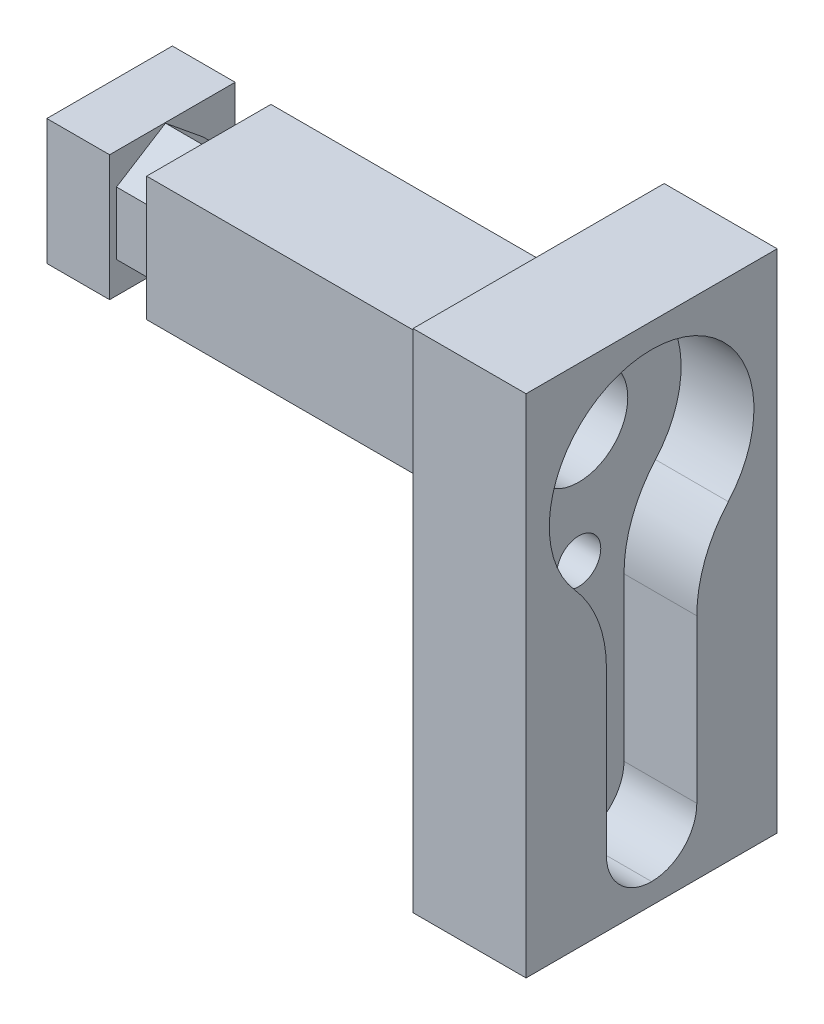
ISO-10303-21;
HEADER;
FILE_DESCRIPTION(('STEP AP214'),'2;1');
FILE_NAME('part.step','',(''),(''),'','','');
FILE_SCHEMA(('AUTOMOTIVE_DESIGN { 1 0 10303 214 1 1 1 1 }'));
ENDSEC;
DATA;
#1=APPLICATION_CONTEXT('core data for automotive mechanical design processes');
#2=APPLICATION_PROTOCOL_DEFINITION('international standard','automotive_design',2000,#1);
#3=PRODUCT_CONTEXT('',#1,'mechanical');
#4=PRODUCT('Part','Part','',(#3));
#5=PRODUCT_RELATED_PRODUCT_CATEGORY('part','',(#4));
#6=PRODUCT_DEFINITION_FORMATION('','',#4);
#7=PRODUCT_DEFINITION_CONTEXT('part definition',#1,'design');
#8=PRODUCT_DEFINITION('design','',#6,#7);
#9=PRODUCT_DEFINITION_SHAPE('','',#8);
#10=(LENGTH_UNIT() NAMED_UNIT(*) SI_UNIT(.MILLI.,.METRE.));
#11=(NAMED_UNIT(*) PLANE_ANGLE_UNIT() SI_UNIT($,.RADIAN.));
#12=(NAMED_UNIT(*) SI_UNIT($,.STERADIAN.) SOLID_ANGLE_UNIT());
#13=UNCERTAINTY_MEASURE_WITH_UNIT(LENGTH_MEASURE(1.E-05),#10,'distance_accuracy_value','');
#14=(GEOMETRIC_REPRESENTATION_CONTEXT(3) GLOBAL_UNCERTAINTY_ASSIGNED_CONTEXT((#13)) GLOBAL_UNIT_ASSIGNED_CONTEXT((#10,
#11,#12)) REPRESENTATION_CONTEXT('',''));
#15=CARTESIAN_POINT('',(0.,0.,0.));
#16=DIRECTION('',(0.,0.,1.));
#17=DIRECTION('',(1.,0.,0.));
#18=AXIS2_PLACEMENT_3D('',#15,#16,#17);
#19=CARTESIAN_POINT('',(-3.27,0.,0.));
#20=DIRECTION('',(1.,0.,0.));
#21=DIRECTION('',(0.,0.,-1.));
#22=AXIS2_PLACEMENT_3D('',#19,#20,#21);
#23=PLANE('',#22);
#24=DIRECTION('',(0.,0.531949195849785,-0.846776270944555));
#25=VECTOR('',#24,1.);
#26=CARTESIAN_POINT('',(-3.27,4.95,0.549999999999998));
#27=LINE('',#26,#25);
#28=CARTESIAN_POINT('',(-3.27,2.5,4.45));
#29=VERTEX_POINT('',#28);
#30=CARTESIAN_POINT('',(-3.27,4.95,0.549999999999996));
#31=VERTEX_POINT('',#30);
#32=EDGE_CURVE('E52',#29,#31,#27,.T.);
#33=ORIENTED_EDGE('',*,*,#32,.F.);
#34=DIRECTION('',(0.,1.,0.));
#35=VECTOR('',#34,1.);
#36=CARTESIAN_POINT('',(-3.27,2.5,4.45));
#37=LINE('',#36,#35);
#38=CARTESIAN_POINT('',(-3.27,-2.5,4.45));
#39=VERTEX_POINT('',#38);
#40=EDGE_CURVE('E56',#39,#29,#37,.T.);
#41=ORIENTED_EDGE('',*,*,#40,.F.);
#42=DIRECTION('',(0.,0.531949195849785,0.846776270944555));
#43=VECTOR('',#42,1.);
#44=CARTESIAN_POINT('',(-3.27,-2.5,4.45));
#45=LINE('',#44,#43);
#46=CARTESIAN_POINT('',(-3.27,-4.95,0.549999999999999));
#47=VERTEX_POINT('',#46);
#48=EDGE_CURVE('E261',#47,#39,#45,.T.);
#49=ORIENTED_EDGE('',*,*,#48,.F.);
#50=DIRECTION('',(0.,0.,1.));
#51=VECTOR('',#50,1.);
#52=CARTESIAN_POINT('',(-3.27,-4.95,4.95));
#53=LINE('',#52,#51);
#54=CARTESIAN_POINT('',(-3.27,-4.95,4.95));
#55=VERTEX_POINT('',#54);
#56=EDGE_CURVE('E285',#47,#55,#53,.T.);
#57=ORIENTED_EDGE('',*,*,#56,.T.);
#58=DIRECTION('',(0.,1.,0.));
#59=VECTOR('',#58,1.);
#60=CARTESIAN_POINT('',(-3.27,4.95,4.95));
#61=LINE('',#60,#59);
#62=CARTESIAN_POINT('',(-3.27,4.95,4.95));
#63=VERTEX_POINT('',#62);
#64=EDGE_CURVE('E290',#55,#63,#61,.T.);
#65=ORIENTED_EDGE('',*,*,#64,.T.);
#66=DIRECTION('',(0.,0.,-1.));
#67=VECTOR('',#66,1.);
#68=CARTESIAN_POINT('',(-3.27,4.95,4.95));
#69=LINE('',#68,#67);
#70=EDGE_CURVE('E293',#63,#31,#69,.T.);
#71=ORIENTED_EDGE('',*,*,#70,.T.);
#72=EDGE_LOOP('',(#33,#41,#49,#57,#65,#71));
#73=FACE_BOUND('',#72,.T.);
#74=ADVANCED_FACE('F36',(#73),#23,.F.);
#75=DIRECTION('',(0.,-0.632534570862424,0.774532127586641));
#76=VECTOR('',#75,1.);
#77=CARTESIAN_POINT('',(-3.27,-2.5,-2.45));
#78=LINE('',#77,#76);
#79=CARTESIAN_POINT('',(-3.27,-2.5,-2.45));
#80=VERTEX_POINT('',#79);
#81=EDGE_CURVE('E258',#80,#47,#78,.T.);
#82=ORIENTED_EDGE('',*,*,#81,.F.);
#83=DIRECTION('',(0.,-1.,0.));
#84=VECTOR('',#83,1.);
#85=CARTESIAN_POINT('',(-3.27,2.5,-2.45));
#86=LINE('',#85,#84);
#87=CARTESIAN_POINT('',(-3.27,2.5,-2.45));
#88=VERTEX_POINT('',#87);
#89=EDGE_CURVE('E255',#88,#80,#86,.T.);
#90=ORIENTED_EDGE('',*,*,#89,.F.);
#91=DIRECTION('',(0.,-0.632534570862424,-0.774532127586641));
#92=VECTOR('',#91,1.);
#93=CARTESIAN_POINT('',(-3.27,4.95,0.549999999999998));
#94=LINE('',#93,#92);
#95=EDGE_CURVE('E228',#31,#88,#94,.T.);
#96=ORIENTED_EDGE('',*,*,#95,.F.);
#97=CARTESIAN_POINT('',(-3.27,4.95,-4.95));
#98=VERTEX_POINT('',#97);
#99=EDGE_CURVE('E292',#31,#98,#69,.T.);
#100=ORIENTED_EDGE('',*,*,#99,.T.);
#101=DIRECTION('',(0.,-1.,0.));
#102=VECTOR('',#101,1.);
#103=CARTESIAN_POINT('',(-3.27,4.95,-4.95));
#104=LINE('',#103,#102);
#105=CARTESIAN_POINT('',(-3.27,-4.95,-4.95));
#106=VERTEX_POINT('',#105);
#107=EDGE_CURVE('E282',#98,#106,#104,.T.);
#108=ORIENTED_EDGE('',*,*,#107,.T.);
#109=EDGE_CURVE('E287',#106,#47,#53,.T.);
#110=ORIENTED_EDGE('',*,*,#109,.T.);
#111=EDGE_LOOP('',(#82,#90,#96,#100,#108,#110));
#112=FACE_BOUND('',#111,.T.);
#113=ADVANCED_FACE('F457',(#112),#23,.F.);
#114=CARTESIAN_POINT('',(23.,0.,0.));
#115=DIRECTION('',(1.,0.,0.));
#116=DIRECTION('',(0.,0.,-1.));
#117=AXIS2_PLACEMENT_3D('',#114,#115,#116);
#118=PLANE('',#117);
#119=CARTESIAN_POINT('',(23.,-20.6,0.));
#120=DIRECTION('',(1.,0.,0.));
#121=DIRECTION('',(0.,0.,-1.));
#122=AXIS2_PLACEMENT_3D('',#119,#120,#121);
#123=CIRCLE('',#122,1.75);
#124=CARTESIAN_POINT('',(23.,-20.6,-1.75));
#125=VERTEX_POINT('',#124);
#126=EDGE_CURVE('E331',#125,#125,#123,.F.);
#127=ORIENTED_EDGE('',*,*,#126,.F.);
#128=EDGE_LOOP('',(#127));
#129=FACE_BOUND('',#128,.T.);
#130=DIRECTION('',(0.,0.,-1.));
#131=VECTOR('',#130,1.);
#132=CARTESIAN_POINT('',(23.,-30.2,0.));
#133=LINE('',#132,#131);
#134=CARTESIAN_POINT('',(23.,-30.2,9.99999999999999));
#135=VERTEX_POINT('',#134);
#136=CARTESIAN_POINT('',(23.,-30.2,-10.));
#137=VERTEX_POINT('',#136);
#138=EDGE_CURVE('E322',#135,#137,#133,.T.);
#139=ORIENTED_EDGE('',*,*,#138,.F.);
#140=DIRECTION('',(0.,-1.,0.));
#141=VECTOR('',#140,1.);
#142=CARTESIAN_POINT('',(23.,10.,10.));
#143=LINE('',#142,#141);
#144=CARTESIAN_POINT('',(23.,10.1,10.));
#145=VERTEX_POINT('',#144);
#146=EDGE_CURVE('E325',#145,#135,#143,.T.);
#147=ORIENTED_EDGE('',*,*,#146,.F.);
#148=DIRECTION('',(0.,0.,-1.));
#149=VECTOR('',#148,1.);
#150=CARTESIAN_POINT('',(23.,10.1,10.1));
#151=LINE('',#150,#149);
#152=CARTESIAN_POINT('',(23.,10.1,-10.));
#153=VERTEX_POINT('',#152);
#154=EDGE_CURVE('E320',#145,#153,#151,.T.);
#155=ORIENTED_EDGE('',*,*,#154,.T.);
#156=DIRECTION('',(0.,1.,0.));
#157=VECTOR('',#156,1.);
#158=CARTESIAN_POINT('',(23.,10.,-10.));
#159=LINE('',#158,#157);
#160=EDGE_CURVE('E328',#137,#153,#159,.T.);
#161=ORIENTED_EDGE('',*,*,#160,.F.);
#162=EDGE_LOOP('',(#139,#147,#155,#161));
#163=FACE_BOUND('',#162,.T.);
#164=CARTESIAN_POINT('',(23.,-9.35,0.));
#165=DIRECTION('',(1.,0.,0.));
#166=DIRECTION('',(0.,0.,-1.));
#167=AXIS2_PLACEMENT_3D('',#164,#165,#166);
#168=CIRCLE('',#167,1.75);
#169=CARTESIAN_POINT('',(23.,-9.35,-1.75));
#170=VERTEX_POINT('',#169);
#171=EDGE_CURVE('E334',#170,#170,#168,.F.);
#172=ORIENTED_EDGE('',*,*,#171,.F.);
#173=EDGE_LOOP('',(#172));
#174=FACE_BOUND('',#173,.T.);
#175=DIRECTION('',(0.,-1.,0.));
#176=VECTOR('',#175,1.);
#177=CARTESIAN_POINT('',(23.,4.95,-4.95));
#178=LINE('',#177,#176);
#179=CARTESIAN_POINT('',(23.,4.95,-4.95));
#180=VERTEX_POINT('',#179);
#181=CARTESIAN_POINT('',(23.,-4.95,-4.95));
#182=VERTEX_POINT('',#181);
#183=EDGE_CURVE('E281',#180,#182,#178,.T.);
#184=ORIENTED_EDGE('',*,*,#183,.F.);
#185=DIRECTION('',(0.,0.,-1.));
#186=VECTOR('',#185,1.);
#187=CARTESIAN_POINT('',(23.,4.95,4.95));
#188=LINE('',#187,#186);
#189=CARTESIAN_POINT('',(23.,4.95,4.95));
#190=VERTEX_POINT('',#189);
#191=EDGE_CURVE('E286',#190,#180,#188,.T.);
#192=ORIENTED_EDGE('',*,*,#191,.F.);
#193=DIRECTION('',(0.,1.,0.));
#194=VECTOR('',#193,1.);
#195=CARTESIAN_POINT('',(23.,4.95,4.95));
#196=LINE('',#195,#194);
#197=CARTESIAN_POINT('',(23.,-4.95,4.95));
#198=VERTEX_POINT('',#197);
#199=EDGE_CURVE('E301',#198,#190,#196,.T.);
#200=ORIENTED_EDGE('',*,*,#199,.F.);
#201=DIRECTION('',(0.,0.,1.));
#202=VECTOR('',#201,1.);
#203=CARTESIAN_POINT('',(23.,-4.95,4.95));
#204=LINE('',#203,#202);
#205=EDGE_CURVE('E298',#182,#198,#204,.T.);
#206=ORIENTED_EDGE('',*,*,#205,.F.);
#207=EDGE_LOOP('',(#184,#192,#200,#206));
#208=FACE_BOUND('',#207,.T.);
#209=ADVANCED_FACE('F462',(#129,#163,#174,#208),#118,.F.);
#210=CARTESIAN_POINT('',(32.,0.,0.));
#211=DIRECTION('',(-1.,0.,0.));
#212=DIRECTION('',(0.,0.,1.));
#213=AXIS2_PLACEMENT_3D('',#210,#211,#212);
#214=CYLINDRICAL_SURFACE('',#213,3.9);
#215=CARTESIAN_POINT('',(23.,0.,0.));
#216=DIRECTION('',(1.,0.,0.));
#217=DIRECTION('',(0.,0.,-1.));
#218=AXIS2_PLACEMENT_3D('',#215,#216,#217);
#219=CIRCLE('',#218,3.9);
#220=CARTESIAN_POINT('',(23.,0.,-3.9));
#221=VERTEX_POINT('',#220);
#222=EDGE_CURVE('E317',#221,#221,#219,.F.);
#223=ORIENTED_EDGE('',*,*,#222,.T.);
#224=EDGE_LOOP('',(#223));
#225=FACE_BOUND('',#224,.T.);
#226=CARTESIAN_POINT('',(26.2,0.,0.));
#227=DIRECTION('',(1.,0.,0.));
#228=DIRECTION('',(0.,0.,-1.));
#229=AXIS2_PLACEMENT_3D('',#226,#227,#228);
#230=CIRCLE('',#229,3.9);
#231=CARTESIAN_POINT('',(26.2,0.,-3.9));
#232=VERTEX_POINT('',#231);
#233=EDGE_CURVE('E40',#232,#232,#230,.T.);
#234=ORIENTED_EDGE('',*,*,#233,.T.);
#235=EDGE_LOOP('',(#234));
#236=FACE_BOUND('',#235,.T.);
#237=ADVANCED_FACE('F491',(#225,#236),#214,.F.);
#238=CARTESIAN_POINT('',(20.,10.,-10.));
#239=DIRECTION('',(0.,0.,1.));
#240=DIRECTION('',(0.,-1.,0.));
#241=AXIS2_PLACEMENT_3D('',#238,#239,#240);
#242=PLANE('',#241);
#243=DIRECTION('',(-1.,0.,0.));
#244=VECTOR('',#243,1.);
#245=CARTESIAN_POINT('',(43.8,-30.2,-10.));
#246=LINE('',#245,#244);
#247=CARTESIAN_POINT('',(32.,-30.2,-10.));
#248=VERTEX_POINT('',#247);
#249=EDGE_CURVE('E346',#248,#137,#246,.T.);
#250=ORIENTED_EDGE('',*,*,#249,.T.);
#251=ORIENTED_EDGE('',*,*,#160,.T.);
#252=DIRECTION('',(-1.,0.,0.));
#253=VECTOR('',#252,1.);
#254=CARTESIAN_POINT('',(32.,10.1,-10.));
#255=LINE('',#254,#253);
#256=CARTESIAN_POINT('',(32.,10.1,-10.));
#257=VERTEX_POINT('',#256);
#258=EDGE_CURVE('E340',#257,#153,#255,.T.);
#259=ORIENTED_EDGE('',*,*,#258,.F.);
#260=DIRECTION('',(0.,-1.,0.));
#261=VECTOR('',#260,1.);
#262=CARTESIAN_POINT('',(32.,0.,-10.));
#263=LINE('',#262,#261);
#264=EDGE_CURVE('E354',#257,#248,#263,.T.);
#265=ORIENTED_EDGE('',*,*,#264,.T.);
#266=EDGE_LOOP('',(#250,#251,#259,#265));
#267=FACE_BOUND('',#266,.T.);
#268=ADVANCED_FACE('F510',(#267),#242,.F.);
#269=CARTESIAN_POINT('',(20.,10.,10.));
#270=DIRECTION('',(0.,0.,-1.));
#271=DIRECTION('',(-1.,0.,0.));
#272=AXIS2_PLACEMENT_3D('',#269,#270,#271);
#273=PLANE('',#272);
#274=DIRECTION('',(1.,0.,0.));
#275=VECTOR('',#274,1.);
#276=CARTESIAN_POINT('',(32.,10.1,10.));
#277=LINE('',#276,#275);
#278=CARTESIAN_POINT('',(32.,10.1,10.));
#279=VERTEX_POINT('',#278);
#280=EDGE_CURVE('E343',#145,#279,#277,.T.);
#281=ORIENTED_EDGE('',*,*,#280,.F.);
#282=ORIENTED_EDGE('',*,*,#146,.T.);
#283=DIRECTION('',(-1.,0.,0.));
#284=VECTOR('',#283,1.);
#285=CARTESIAN_POINT('',(43.8,-30.2,9.99999999999999));
#286=LINE('',#285,#284);
#287=CARTESIAN_POINT('',(32.,-30.2,9.99999999999999));
#288=VERTEX_POINT('',#287);
#289=EDGE_CURVE('E345',#288,#135,#286,.T.);
#290=ORIENTED_EDGE('',*,*,#289,.F.);
#291=DIRECTION('',(0.,1.,0.));
#292=VECTOR('',#291,1.);
#293=CARTESIAN_POINT('',(32.,0.,9.99999999999999));
#294=LINE('',#293,#292);
#295=EDGE_CURVE('E349',#288,#279,#294,.T.);
#296=ORIENTED_EDGE('',*,*,#295,.T.);
#297=EDGE_LOOP('',(#281,#282,#290,#296));
#298=FACE_BOUND('',#297,.T.);
#299=ADVANCED_FACE('F523',(#298),#273,.F.);
#300=CARTESIAN_POINT('',(32.,0.,0.));
#301=DIRECTION('',(1.,0.,0.));
#302=DIRECTION('',(0.,0.,-1.));
#303=AXIS2_PLACEMENT_3D('',#300,#301,#302);
#304=PLANE('',#303);
#305=ORIENTED_EDGE('',*,*,#264,.F.);
#306=DIRECTION('',(0.,0.,-1.));
#307=VECTOR('',#306,1.);
#308=CARTESIAN_POINT('',(32.,10.1,-10.));
#309=LINE('',#308,#307);
#310=EDGE_CURVE('E337',#279,#257,#309,.T.);
#311=ORIENTED_EDGE('',*,*,#310,.F.);
#312=ORIENTED_EDGE('',*,*,#295,.F.);
#313=DIRECTION('',(0.,0.,1.));
#314=VECTOR('',#313,1.);
#315=CARTESIAN_POINT('',(32.,-30.2,22.5));
#316=LINE('',#315,#314);
#317=EDGE_CURVE('E356',#248,#288,#316,.T.);
#318=ORIENTED_EDGE('',*,*,#317,.F.);
#319=EDGE_LOOP('',(#305,#311,#312,#318));
#320=FACE_BOUND('',#319,.T.);
#321=DIRECTION('',(0.,-1.,0.));
#322=VECTOR('',#321,1.);
#323=CARTESIAN_POINT('',(32.,-28.55,3.60000000000001));
#324=LINE('',#323,#322);
#325=CARTESIAN_POINT('',(32.,-12.0192553845902,3.6));
#326=VERTEX_POINT('',#325);
#327=CARTESIAN_POINT('',(32.,-24.95,3.60000000000001));
#328=VERTEX_POINT('',#327);
#329=EDGE_CURVE('E375',#326,#328,#324,.T.);
#330=ORIENTED_EDGE('',*,*,#329,.F.);
#331=CARTESIAN_POINT('',(32.,-12.0192553845902,13.6));
#332=DIRECTION('',(1.,0.,0.));
#333=DIRECTION('',(0.,0.,-1.));
#334=AXIS2_PLACEMENT_3D('',#331,#332,#333);
#335=CIRCLE('',#334,10.);
#336=CARTESIAN_POINT('',(32.,-5.39707610933388,6.1068870523416));
#337=VERTEX_POINT('',#336);
#338=EDGE_CURVE('E403',#326,#337,#335,.T.);
#339=ORIENTED_EDGE('',*,*,#338,.T.);
#340=CARTESIAN_POINT('',(32.,0.,0.));
#341=DIRECTION('',(1.,0.,0.));
#342=DIRECTION('',(0.,0.,-1.));
#343=AXIS2_PLACEMENT_3D('',#340,#341,#342);
#344=CIRCLE('',#343,8.15);
#345=CARTESIAN_POINT('',(32.,-5.39707610933388,-6.1068870523416));
#346=VERTEX_POINT('',#345);
#347=EDGE_CURVE('E368',#346,#337,#344,.T.);
#348=ORIENTED_EDGE('',*,*,#347,.F.);
#349=CARTESIAN_POINT('',(32.,-12.0192553845902,-13.6));
#350=DIRECTION('',(1.,0.,0.));
#351=DIRECTION('',(0.,0.,-1.));
#352=AXIS2_PLACEMENT_3D('',#349,#350,#351);
#353=CIRCLE('',#352,10.);
#354=CARTESIAN_POINT('',(32.,-12.0192553845902,-3.6));
#355=VERTEX_POINT('',#354);
#356=EDGE_CURVE('E401',#346,#355,#353,.T.);
#357=ORIENTED_EDGE('',*,*,#356,.T.);
#358=DIRECTION('',(0.,1.,0.));
#359=VECTOR('',#358,1.);
#360=CARTESIAN_POINT('',(32.,-28.55,-3.59999999999999));
#361=LINE('',#360,#359);
#362=CARTESIAN_POINT('',(32.,-24.95,-3.59999999999999));
#363=VERTEX_POINT('',#362);
#364=EDGE_CURVE('E377',#363,#355,#361,.T.);
#365=ORIENTED_EDGE('',*,*,#364,.F.);
#366=CARTESIAN_POINT('',(32.,-24.95,0.));
#367=DIRECTION('',(1.,0.,0.));
#368=DIRECTION('',(0.,0.,-1.));
#369=AXIS2_PLACEMENT_3D('',#366,#367,#368);
#370=CIRCLE('',#369,3.6);
#371=CARTESIAN_POINT('',(32.,-28.55,0.));
#372=VERTEX_POINT('',#371);
#373=EDGE_CURVE('E394',#363,#372,#370,.F.);
#374=ORIENTED_EDGE('',*,*,#373,.T.);
#375=CARTESIAN_POINT('',(32.,-24.95,0.));
#376=DIRECTION('',(1.,0.,0.));
#377=DIRECTION('',(0.,0.,-1.));
#378=AXIS2_PLACEMENT_3D('',#375,#376,#377);
#379=CIRCLE('',#378,3.6);
#380=EDGE_CURVE('E391',#372,#328,#379,.F.);
#381=ORIENTED_EDGE('',*,*,#380,.T.);
#382=EDGE_LOOP('',(#330,#339,#348,#357,#365,#374,#381));
#383=FACE_BOUND('',#382,.T.);
#384=ADVANCED_FACE('F428',(#320,#383),#304,.T.);
#385=CARTESIAN_POINT('',(26.2,-28.55,3.60000000000001));
#386=DIRECTION('',(0.,0.,1.));
#387=DIRECTION('',(0.,-1.,0.));
#388=AXIS2_PLACEMENT_3D('',#385,#386,#387);
#389=PLANE('',#388);
#390=DIRECTION('',(0.,-1.,0.));
#391=VECTOR('',#390,1.);
#392=CARTESIAN_POINT('',(26.2,-28.55,3.60000000000001));
#393=LINE('',#392,#391);
#394=CARTESIAN_POINT('',(26.2,-12.0192553845902,3.6));
#395=VERTEX_POINT('',#394);
#396=CARTESIAN_POINT('',(26.2,-24.95,3.60000000000001));
#397=VERTEX_POINT('',#396);
#398=EDGE_CURVE('E365',#395,#397,#393,.T.);
#399=ORIENTED_EDGE('',*,*,#398,.F.);
#400=DIRECTION('',(1.,0.,0.));
#401=VECTOR('',#400,1.);
#402=CARTESIAN_POINT('',(26.2,-12.0192553845902,3.6));
#403=LINE('',#402,#401);
#404=EDGE_CURVE('E396',#395,#326,#403,.T.);
#405=ORIENTED_EDGE('',*,*,#404,.T.);
#406=ORIENTED_EDGE('',*,*,#329,.T.);
#407=DIRECTION('',(1.,0.,0.));
#408=VECTOR('',#407,1.);
#409=CARTESIAN_POINT('',(26.2,-24.95,3.60000000000001));
#410=LINE('',#409,#408);
#411=EDGE_CURVE('E374',#328,#397,#410,.F.);
#412=ORIENTED_EDGE('',*,*,#411,.T.);
#413=EDGE_LOOP('',(#399,#405,#406,#412));
#414=FACE_BOUND('',#413,.T.);
#415=ADVANCED_FACE('F422',(#414),#389,.F.);
#416=CARTESIAN_POINT('',(26.2,0.,0.));
#417=DIRECTION('',(1.,0.,0.));
#418=DIRECTION('',(0.,0.,-1.));
#419=AXIS2_PLACEMENT_3D('',#416,#417,#418);
#420=CYLINDRICAL_SURFACE('',#419,8.15);
#421=ORIENTED_EDGE('',*,*,#347,.T.);
#422=DIRECTION('',(1.,0.,0.));
#423=VECTOR('',#422,1.);
#424=CARTESIAN_POINT('',(26.2,-5.39707610933388,6.1068870523416));
#425=LINE('',#424,#423);
#426=CARTESIAN_POINT('',(26.2,-5.39707610933388,6.1068870523416));
#427=VERTEX_POINT('',#426);
#428=EDGE_CURVE('E408',#337,#427,#425,.F.);
#429=ORIENTED_EDGE('',*,*,#428,.T.);
#430=CARTESIAN_POINT('',(26.2,0.,0.));
#431=DIRECTION('',(1.,0.,0.));
#432=DIRECTION('',(0.,0.,-1.));
#433=AXIS2_PLACEMENT_3D('',#430,#431,#432);
#434=CIRCLE('',#433,8.15);
#435=CARTESIAN_POINT('',(26.2,-5.39707610933388,-6.1068870523416));
#436=VERTEX_POINT('',#435);
#437=EDGE_CURVE('E371',#436,#427,#434,.T.);
#438=ORIENTED_EDGE('',*,*,#437,.F.);
#439=DIRECTION('',(1.,0.,0.));
#440=VECTOR('',#439,1.);
#441=CARTESIAN_POINT('',(26.2,-5.39707610933388,-6.1068870523416));
#442=LINE('',#441,#440);
#443=EDGE_CURVE('E405',#436,#346,#442,.T.);
#444=ORIENTED_EDGE('',*,*,#443,.T.);
#445=EDGE_LOOP('',(#421,#429,#438,#444));
#446=FACE_BOUND('',#445,.T.);
#447=ADVANCED_FACE('F430',(#446),#420,.F.);
#448=CARTESIAN_POINT('',(26.2,-28.55,-3.59999999999999));
#449=DIRECTION('',(0.,0.,-1.));
#450=DIRECTION('',(0.,1.,0.));
#451=AXIS2_PLACEMENT_3D('',#448,#449,#450);
#452=PLANE('',#451);
#453=ORIENTED_EDGE('',*,*,#364,.T.);
#454=DIRECTION('',(1.,0.,0.));
#455=VECTOR('',#454,1.);
#456=CARTESIAN_POINT('',(26.2,-12.0192553845902,-3.6));
#457=LINE('',#456,#455);
#458=CARTESIAN_POINT('',(26.2,-12.0192553845902,-3.6));
#459=VERTEX_POINT('',#458);
#460=EDGE_CURVE('E410',#355,#459,#457,.F.);
#461=ORIENTED_EDGE('',*,*,#460,.T.);
#462=DIRECTION('',(0.,1.,0.));
#463=VECTOR('',#462,1.);
#464=CARTESIAN_POINT('',(26.2,-28.55,-3.59999999999999));
#465=LINE('',#464,#463);
#466=CARTESIAN_POINT('',(26.2,-24.95,-3.59999999999999));
#467=VERTEX_POINT('',#466);
#468=EDGE_CURVE('E367',#467,#459,#465,.T.);
#469=ORIENTED_EDGE('',*,*,#468,.F.);
#470=DIRECTION('',(1.,0.,0.));
#471=VECTOR('',#470,1.);
#472=CARTESIAN_POINT('',(32.,-24.95,-3.59999999999999));
#473=LINE('',#472,#471);
#474=EDGE_CURVE('E389',#467,#363,#473,.T.);
#475=ORIENTED_EDGE('',*,*,#474,.T.);
#476=EDGE_LOOP('',(#453,#461,#469,#475));
#477=FACE_BOUND('',#476,.T.);
#478=ADVANCED_FACE('F438',(#477),#452,.F.);
#479=CARTESIAN_POINT('',(26.2,0.,0.));
#480=DIRECTION('',(1.,0.,0.));
#481=DIRECTION('',(0.,0.,-1.));
#482=AXIS2_PLACEMENT_3D('',#479,#480,#481);
#483=PLANE('',#482);
#484=CARTESIAN_POINT('',(26.2,-20.6,0.));
#485=DIRECTION('',(1.,0.,0.));
#486=DIRECTION('',(0.,0.,-1.));
#487=AXIS2_PLACEMENT_3D('',#484,#485,#486);
#488=CIRCLE('',#487,1.75);
#489=CARTESIAN_POINT('',(26.2,-20.6,-1.75));
#490=VERTEX_POINT('',#489);
#491=EDGE_CURVE('E360',#490,#490,#488,.T.);
#492=ORIENTED_EDGE('',*,*,#491,.F.);
#493=EDGE_LOOP('',(#492));
#494=FACE_BOUND('',#493,.T.);
#495=CARTESIAN_POINT('',(26.2,-9.35,0.));
#496=DIRECTION('',(1.,0.,0.));
#497=DIRECTION('',(0.,0.,-1.));
#498=AXIS2_PLACEMENT_3D('',#495,#496,#497);
#499=CIRCLE('',#498,1.75);
#500=CARTESIAN_POINT('',(26.2,-9.35,-1.75));
#501=VERTEX_POINT('',#500);
#502=EDGE_CURVE('E359',#501,#501,#499,.T.);
#503=ORIENTED_EDGE('',*,*,#502,.F.);
#504=EDGE_LOOP('',(#503));
#505=FACE_BOUND('',#504,.T.);
#506=ORIENTED_EDGE('',*,*,#233,.F.);
#507=EDGE_LOOP('',(#506));
#508=FACE_BOUND('',#507,.T.);
#509=ORIENTED_EDGE('',*,*,#437,.T.);
#510=CARTESIAN_POINT('',(26.2,-12.0192553845902,13.6));
#511=DIRECTION('',(1.,0.,0.));
#512=DIRECTION('',(0.,0.,-1.));
#513=AXIS2_PLACEMENT_3D('',#510,#511,#512);
#514=CIRCLE('',#513,10.);
#515=EDGE_CURVE('E45',#427,#395,#514,.F.);
#516=ORIENTED_EDGE('',*,*,#515,.T.);
#517=ORIENTED_EDGE('',*,*,#398,.T.);
#518=CARTESIAN_POINT('',(26.2,-24.95,0.));
#519=DIRECTION('',(1.,0.,0.));
#520=DIRECTION('',(0.,0.,-1.));
#521=AXIS2_PLACEMENT_3D('',#518,#519,#520);
#522=CIRCLE('',#521,3.6);
#523=CARTESIAN_POINT('',(26.2,-28.55,0.));
#524=VERTEX_POINT('',#523);
#525=EDGE_CURVE('E387',#397,#524,#522,.T.);
#526=ORIENTED_EDGE('',*,*,#525,.T.);
#527=CARTESIAN_POINT('',(26.2,-24.95,0.));
#528=DIRECTION('',(1.,0.,0.));
#529=DIRECTION('',(0.,0.,-1.));
#530=AXIS2_PLACEMENT_3D('',#527,#528,#529);
#531=CIRCLE('',#530,3.6);
#532=EDGE_CURVE('E385',#524,#467,#531,.T.);
#533=ORIENTED_EDGE('',*,*,#532,.T.);
#534=ORIENTED_EDGE('',*,*,#468,.T.);
#535=CARTESIAN_POINT('',(26.2,-12.0192553845902,-13.6));
#536=DIRECTION('',(1.,0.,0.));
#537=DIRECTION('',(0.,0.,-1.));
#538=AXIS2_PLACEMENT_3D('',#535,#536,#537);
#539=CIRCLE('',#538,10.);
#540=EDGE_CURVE('E11',#459,#436,#539,.F.);
#541=ORIENTED_EDGE('',*,*,#540,.T.);
#542=EDGE_LOOP('',(#509,#516,#517,#526,#533,#534,#541));
#543=FACE_BOUND('',#542,.T.);
#544=ADVANCED_FACE('F415',(#494,#505,#508,#543),#483,.T.);
#545=CARTESIAN_POINT('',(26.2,-24.95,0.));
#546=DIRECTION('',(-1.,0.,0.));
#547=DIRECTION('',(0.,0.,1.));
#548=AXIS2_PLACEMENT_3D('',#545,#546,#547);
#549=CYLINDRICAL_SURFACE('',#548,3.6);
#550=ORIENTED_EDGE('',*,*,#474,.F.);
#551=ORIENTED_EDGE('',*,*,#532,.F.);
#552=DIRECTION('',(1.,0.,0.));
#553=VECTOR('',#552,1.);
#554=CARTESIAN_POINT('',(26.2,-28.55,0.));
#555=LINE('',#554,#553);
#556=EDGE_CURVE('E378',#372,#524,#555,.F.);
#557=ORIENTED_EDGE('',*,*,#556,.F.);
#558=ORIENTED_EDGE('',*,*,#373,.F.);
#559=EDGE_LOOP('',(#550,#551,#557,#558));
#560=FACE_BOUND('',#559,.T.);
#561=ADVANCED_FACE('F443',(#560),#549,.F.);
#562=CARTESIAN_POINT('',(26.2,-24.95,0.));
#563=DIRECTION('',(-1.,0.,0.));
#564=DIRECTION('',(0.,0.,1.));
#565=AXIS2_PLACEMENT_3D('',#562,#563,#564);
#566=CYLINDRICAL_SURFACE('',#565,3.6);
#567=ORIENTED_EDGE('',*,*,#525,.F.);
#568=ORIENTED_EDGE('',*,*,#411,.F.);
#569=ORIENTED_EDGE('',*,*,#380,.F.);
#570=ORIENTED_EDGE('',*,*,#556,.T.);
#571=EDGE_LOOP('',(#567,#568,#569,#570));
#572=FACE_BOUND('',#571,.T.);
#573=ADVANCED_FACE('F447',(#572),#566,.F.);
#574=CARTESIAN_POINT('',(26.2,-12.0192553845902,13.6));
#575=DIRECTION('',(1.,0.,0.));
#576=DIRECTION('',(0.,0.,-1.));
#577=AXIS2_PLACEMENT_3D('',#574,#575,#576);
#578=CYLINDRICAL_SURFACE('',#577,10.);
#579=ORIENTED_EDGE('',*,*,#515,.F.);
#580=ORIENTED_EDGE('',*,*,#428,.F.);
#581=ORIENTED_EDGE('',*,*,#338,.F.);
#582=ORIENTED_EDGE('',*,*,#404,.F.);
#583=EDGE_LOOP('',(#579,#580,#581,#582));
#584=FACE_BOUND('',#583,.T.);
#585=ADVANCED_FACE('F425',(#584),#578,.T.);
#586=CARTESIAN_POINT('',(26.2,-12.0192553845902,-13.6));
#587=DIRECTION('',(1.,0.,0.));
#588=DIRECTION('',(0.,0.,-1.));
#589=AXIS2_PLACEMENT_3D('',#586,#587,#588);
#590=CYLINDRICAL_SURFACE('',#589,10.);
#591=ORIENTED_EDGE('',*,*,#540,.F.);
#592=ORIENTED_EDGE('',*,*,#460,.F.);
#593=ORIENTED_EDGE('',*,*,#356,.F.);
#594=ORIENTED_EDGE('',*,*,#443,.F.);
#595=EDGE_LOOP('',(#591,#592,#593,#594));
#596=FACE_BOUND('',#595,.T.);
#597=ADVANCED_FACE('F38',(#596),#590,.T.);
#598=CARTESIAN_POINT('',(-0.001000000000001,-9.35,0.));
#599=DIRECTION('',(1.,0.,0.));
#600=DIRECTION('',(0.,0.,-1.));
#601=AXIS2_PLACEMENT_3D('',#598,#599,#600);
#602=CYLINDRICAL_SURFACE('',#601,1.75);
#603=ORIENTED_EDGE('',*,*,#171,.T.);
#604=EDGE_LOOP('',(#603));
#605=FACE_BOUND('',#604,.T.);
#606=ORIENTED_EDGE('',*,*,#502,.T.);
#607=EDGE_LOOP('',(#606));
#608=FACE_BOUND('',#607,.T.);
#609=ADVANCED_FACE('F503',(#605,#608),#602,.F.);
#610=CARTESIAN_POINT('',(-0.001000000000001,-20.6,0.));
#611=DIRECTION('',(1.,0.,0.));
#612=DIRECTION('',(0.,0.,-1.));
#613=AXIS2_PLACEMENT_3D('',#610,#611,#612);
#614=CYLINDRICAL_SURFACE('',#613,1.75);
#615=ORIENTED_EDGE('',*,*,#126,.T.);
#616=EDGE_LOOP('',(#615));
#617=FACE_BOUND('',#616,.T.);
#618=ORIENTED_EDGE('',*,*,#491,.T.);
#619=EDGE_LOOP('',(#618));
#620=FACE_BOUND('',#619,.T.);
#621=ADVANCED_FACE('F499',(#617,#620),#614,.F.);
#622=CARTESIAN_POINT('',(0.,-30.2,0.));
#623=DIRECTION('',(0.,1.,0.));
#624=DIRECTION('',(0.,0.,1.));
#625=AXIS2_PLACEMENT_3D('',#622,#623,#624);
#626=PLANE('',#625);
#627=ORIENTED_EDGE('',*,*,#289,.T.);
#628=ORIENTED_EDGE('',*,*,#138,.T.);
#629=ORIENTED_EDGE('',*,*,#249,.F.);
#630=ORIENTED_EDGE('',*,*,#317,.T.);
#631=EDGE_LOOP('',(#627,#628,#629,#630));
#632=FACE_BOUND('',#631,.T.);
#633=ADVANCED_FACE('F495',(#632),#626,.F.);
#634=CARTESIAN_POINT('',(48.5671139599365,10.1,10.1));
#635=DIRECTION('',(0.,1.,0.));
#636=DIRECTION('',(0.,0.,1.));
#637=AXIS2_PLACEMENT_3D('',#634,#635,#636);
#638=PLANE('',#637);
#639=ORIENTED_EDGE('',*,*,#154,.F.);
#640=ORIENTED_EDGE('',*,*,#280,.T.);
#641=ORIENTED_EDGE('',*,*,#310,.T.);
#642=ORIENTED_EDGE('',*,*,#258,.T.);
#643=EDGE_LOOP('',(#639,#640,#641,#642));
#644=FACE_BOUND('',#643,.T.);
#645=ADVANCED_FACE('F477',(#644),#638,.T.);
#646=CARTESIAN_POINT('',(-3.27,4.95,4.95));
#647=DIRECTION('',(0.,-1.,0.));
#648=DIRECTION('',(0.,0.,-1.));
#649=AXIS2_PLACEMENT_3D('',#646,#647,#648);
#650=PLANE('',#649);
#651=ORIENTED_EDGE('',*,*,#191,.T.);
#652=DIRECTION('',(1.,0.,0.));
#653=VECTOR('',#652,1.);
#654=CARTESIAN_POINT('',(-3.27,4.95,-4.95));
#655=LINE('',#654,#653);
#656=EDGE_CURVE('E295',#98,#180,#655,.T.);
#657=ORIENTED_EDGE('',*,*,#656,.F.);
#658=ORIENTED_EDGE('',*,*,#99,.F.);
#659=ORIENTED_EDGE('',*,*,#70,.F.);
#660=DIRECTION('',(1.,0.,0.));
#661=VECTOR('',#660,1.);
#662=CARTESIAN_POINT('',(-3.27,4.95,4.95));
#663=LINE('',#662,#661);
#664=EDGE_CURVE('E308',#63,#190,#663,.T.);
#665=ORIENTED_EDGE('',*,*,#664,.T.);
#666=EDGE_LOOP('',(#651,#657,#658,#659,#665));
#667=FACE_BOUND('',#666,.T.);
#668=ADVANCED_FACE('F473',(#667),#650,.F.);
#669=CARTESIAN_POINT('',(-3.27,4.95,4.95));
#670=DIRECTION('',(0.,0.,-1.));
#671=DIRECTION('',(0.,1.,0.));
#672=AXIS2_PLACEMENT_3D('',#669,#670,#671);
#673=PLANE('',#672);
#674=ORIENTED_EDGE('',*,*,#199,.T.);
#675=ORIENTED_EDGE('',*,*,#664,.F.);
#676=ORIENTED_EDGE('',*,*,#64,.F.);
#677=DIRECTION('',(1.,0.,0.));
#678=VECTOR('',#677,1.);
#679=CARTESIAN_POINT('',(-3.27,-4.95,4.95));
#680=LINE('',#679,#678);
#681=EDGE_CURVE('E311',#55,#198,#680,.T.);
#682=ORIENTED_EDGE('',*,*,#681,.T.);
#683=EDGE_LOOP('',(#674,#675,#676,#682));
#684=FACE_BOUND('',#683,.T.);
#685=ADVANCED_FACE('F476',(#684),#673,.F.);
#686=CARTESIAN_POINT('',(-3.27,-4.95,4.95));
#687=DIRECTION('',(0.,1.,0.));
#688=DIRECTION('',(0.,0.,1.));
#689=AXIS2_PLACEMENT_3D('',#686,#687,#688);
#690=PLANE('',#689);
#691=ORIENTED_EDGE('',*,*,#205,.T.);
#692=ORIENTED_EDGE('',*,*,#681,.F.);
#693=ORIENTED_EDGE('',*,*,#56,.F.);
#694=ORIENTED_EDGE('',*,*,#109,.F.);
#695=DIRECTION('',(1.,0.,0.));
#696=VECTOR('',#695,1.);
#697=CARTESIAN_POINT('',(-3.27,-4.95,-4.95));
#698=LINE('',#697,#696);
#699=EDGE_CURVE('E314',#106,#182,#698,.T.);
#700=ORIENTED_EDGE('',*,*,#699,.T.);
#701=EDGE_LOOP('',(#691,#692,#693,#694,#700));
#702=FACE_BOUND('',#701,.T.);
#703=ADVANCED_FACE('F481',(#702),#690,.F.);
#704=CARTESIAN_POINT('',(-3.27,4.95,-4.95));
#705=DIRECTION('',(0.,0.,1.));
#706=DIRECTION('',(0.,-1.,0.));
#707=AXIS2_PLACEMENT_3D('',#704,#705,#706);
#708=PLANE('',#707);
#709=ORIENTED_EDGE('',*,*,#183,.T.);
#710=ORIENTED_EDGE('',*,*,#699,.F.);
#711=ORIENTED_EDGE('',*,*,#107,.F.);
#712=ORIENTED_EDGE('',*,*,#656,.T.);
#713=EDGE_LOOP('',(#709,#710,#711,#712));
#714=FACE_BOUND('',#713,.T.);
#715=ADVANCED_FACE('F471',(#714),#708,.F.);
#716=CARTESIAN_POINT('',(23.,0.,0.));
#717=DIRECTION('',(1.,0.,0.));
#718=DIRECTION('',(0.,0.,-1.));
#719=AXIS2_PLACEMENT_3D('',#716,#717,#718);
#720=PLANE('',#719);
#721=ORIENTED_EDGE('',*,*,#222,.F.);
#722=EDGE_LOOP('',(#721));
#723=FACE_BOUND('',#722,.T.);
#724=ADVANCED_FACE('F468',(#723),#720,.T.);
#725=CARTESIAN_POINT('',(-6.17,4.95,0.549999999999998));
#726=DIRECTION('',(0.,-0.846776270944556,-0.531949195849785));
#727=DIRECTION('',(0.,0.531949195849785,-0.846776270944556));
#728=AXIS2_PLACEMENT_3D('',#725,#726,#727);
#729=PLANE('',#728);
#730=ORIENTED_EDGE('',*,*,#32,.T.);
#731=DIRECTION('',(1.,0.,0.));
#732=VECTOR('',#731,1.);
#733=CARTESIAN_POINT('',(-6.17,4.95,0.549999999999998));
#734=LINE('',#733,#732);
#735=CARTESIAN_POINT('',(-6.17,4.95,0.549999999999998));
#736=VERTEX_POINT('',#735);
#737=EDGE_CURVE('E278',#736,#31,#734,.T.);
#738=ORIENTED_EDGE('',*,*,#737,.F.);
#739=DIRECTION('',(0.,0.531949195849785,-0.846776270944555));
#740=VECTOR('',#739,1.);
#741=CARTESIAN_POINT('',(-6.17,4.95,0.549999999999998));
#742=LINE('',#741,#740);
#743=CARTESIAN_POINT('',(-6.17,2.5,4.45));
#744=VERTEX_POINT('',#743);
#745=EDGE_CURVE('E234',#744,#736,#742,.T.);
#746=ORIENTED_EDGE('',*,*,#745,.F.);
#747=DIRECTION('',(1.,0.,0.));
#748=VECTOR('',#747,1.);
#749=CARTESIAN_POINT('',(-6.17,2.5,4.45));
#750=LINE('',#749,#748);
#751=EDGE_CURVE('E251',#744,#29,#750,.T.);
#752=ORIENTED_EDGE('',*,*,#751,.T.);
#753=EDGE_LOOP('',(#730,#738,#746,#752));
#754=FACE_BOUND('',#753,.T.);
#755=ADVANCED_FACE('F466',(#754),#729,.F.);
#756=CARTESIAN_POINT('',(-6.17,4.95,0.549999999999998));
#757=DIRECTION('',(0.,-0.774532127586641,0.632534570862424));
#758=DIRECTION('',(0.,-0.632534570862424,-0.774532127586641));
#759=AXIS2_PLACEMENT_3D('',#756,#757,#758);
#760=PLANE('',#759);
#761=ORIENTED_EDGE('',*,*,#95,.T.);
#762=DIRECTION('',(1.,0.,0.));
#763=VECTOR('',#762,1.);
#764=CARTESIAN_POINT('',(-6.17,2.5,-2.45));
#765=LINE('',#764,#763);
#766=CARTESIAN_POINT('',(-6.17,2.5,-2.45));
#767=VERTEX_POINT('',#766);
#768=EDGE_CURVE('E275',#767,#88,#765,.T.);
#769=ORIENTED_EDGE('',*,*,#768,.F.);
#770=DIRECTION('',(0.,-0.632534570862424,-0.774532127586641));
#771=VECTOR('',#770,1.);
#772=CARTESIAN_POINT('',(-6.17,4.95,0.549999999999998));
#773=LINE('',#772,#771);
#774=EDGE_CURVE('E237',#736,#767,#773,.T.);
#775=ORIENTED_EDGE('',*,*,#774,.F.);
#776=ORIENTED_EDGE('',*,*,#737,.T.);
#777=EDGE_LOOP('',(#761,#769,#775,#776));
#778=FACE_BOUND('',#777,.T.);
#779=ADVANCED_FACE('F551',(#778),#760,.F.);
#780=CARTESIAN_POINT('',(-6.17,2.5,-2.45));
#781=DIRECTION('',(0.,0.,1.));
#782=DIRECTION('',(0.,-1.,0.));
#783=AXIS2_PLACEMENT_3D('',#780,#781,#782);
#784=PLANE('',#783);
#785=ORIENTED_EDGE('',*,*,#89,.T.);
#786=DIRECTION('',(1.,0.,0.));
#787=VECTOR('',#786,1.);
#788=CARTESIAN_POINT('',(-6.17,-2.5,-2.45));
#789=LINE('',#788,#787);
#790=CARTESIAN_POINT('',(-6.17,-2.5,-2.45));
#791=VERTEX_POINT('',#790);
#792=EDGE_CURVE('E272',#791,#80,#789,.T.);
#793=ORIENTED_EDGE('',*,*,#792,.F.);
#794=DIRECTION('',(0.,-1.,0.));
#795=VECTOR('',#794,1.);
#796=CARTESIAN_POINT('',(-6.17,2.5,-2.45));
#797=LINE('',#796,#795);
#798=EDGE_CURVE('E240',#767,#791,#797,.T.);
#799=ORIENTED_EDGE('',*,*,#798,.F.);
#800=ORIENTED_EDGE('',*,*,#768,.T.);
#801=EDGE_LOOP('',(#785,#793,#799,#800));
#802=FACE_BOUND('',#801,.T.);
#803=ADVANCED_FACE('F569',(#802),#784,.F.);
#804=CARTESIAN_POINT('',(-6.17,-2.5,-2.45));
#805=DIRECTION('',(0.,0.774532127586641,0.632534570862424));
#806=DIRECTION('',(0.,-0.632534570862424,0.774532127586641));
#807=AXIS2_PLACEMENT_3D('',#804,#805,#806);
#808=PLANE('',#807);
#809=ORIENTED_EDGE('',*,*,#81,.T.);
#810=DIRECTION('',(1.,0.,0.));
#811=VECTOR('',#810,1.);
#812=CARTESIAN_POINT('',(-6.17,-4.95,0.549999999999998));
#813=LINE('',#812,#811);
#814=CARTESIAN_POINT('',(-6.17,-4.95,0.549999999999998));
#815=VERTEX_POINT('',#814);
#816=EDGE_CURVE('E269',#815,#47,#813,.T.);
#817=ORIENTED_EDGE('',*,*,#816,.F.);
#818=DIRECTION('',(0.,-0.632534570862424,0.774532127586641));
#819=VECTOR('',#818,1.);
#820=CARTESIAN_POINT('',(-6.17,-2.5,-2.45));
#821=LINE('',#820,#819);
#822=EDGE_CURVE('E243',#791,#815,#821,.T.);
#823=ORIENTED_EDGE('',*,*,#822,.F.);
#824=ORIENTED_EDGE('',*,*,#792,.T.);
#825=EDGE_LOOP('',(#809,#817,#823,#824));
#826=FACE_BOUND('',#825,.T.);
#827=ADVANCED_FACE('F567',(#826),#808,.F.);
#828=CARTESIAN_POINT('',(-6.17,-2.5,4.45));
#829=DIRECTION('',(0.,0.846776270944555,-0.531949195849785));
#830=DIRECTION('',(0.,0.531949195849785,0.846776270944555));
#831=AXIS2_PLACEMENT_3D('',#828,#829,#830);
#832=PLANE('',#831);
#833=ORIENTED_EDGE('',*,*,#48,.T.);
#834=DIRECTION('',(1.,0.,0.));
#835=VECTOR('',#834,1.);
#836=CARTESIAN_POINT('',(-6.17,-2.5,4.45));
#837=LINE('',#836,#835);
#838=CARTESIAN_POINT('',(-6.17,-2.5,4.45));
#839=VERTEX_POINT('',#838);
#840=EDGE_CURVE('E266',#839,#39,#837,.T.);
#841=ORIENTED_EDGE('',*,*,#840,.F.);
#842=DIRECTION('',(0.,0.531949195849785,0.846776270944555));
#843=VECTOR('',#842,1.);
#844=CARTESIAN_POINT('',(-6.17,-2.5,4.45));
#845=LINE('',#844,#843);
#846=EDGE_CURVE('E246',#815,#839,#845,.T.);
#847=ORIENTED_EDGE('',*,*,#846,.F.);
#848=ORIENTED_EDGE('',*,*,#816,.T.);
#849=EDGE_LOOP('',(#833,#841,#847,#848));
#850=FACE_BOUND('',#849,.T.);
#851=ADVANCED_FACE('F563',(#850),#832,.F.);
#852=CARTESIAN_POINT('',(-6.17,2.5,4.45));
#853=DIRECTION('',(0.,0.,-1.));
#854=DIRECTION('',(-1.,0.,0.));
#855=AXIS2_PLACEMENT_3D('',#852,#853,#854);
#856=PLANE('',#855);
#857=ORIENTED_EDGE('',*,*,#40,.T.);
#858=ORIENTED_EDGE('',*,*,#751,.F.);
#859=DIRECTION('',(0.,1.,0.));
#860=VECTOR('',#859,1.);
#861=CARTESIAN_POINT('',(-6.17,2.5,4.45));
#862=LINE('',#861,#860);
#863=EDGE_CURVE('E249',#839,#744,#862,.T.);
#864=ORIENTED_EDGE('',*,*,#863,.F.);
#865=ORIENTED_EDGE('',*,*,#840,.T.);
#866=EDGE_LOOP('',(#857,#858,#864,#865));
#867=FACE_BOUND('',#866,.T.);
#868=ADVANCED_FACE('F556',(#867),#856,.F.);
#869=CARTESIAN_POINT('',(-11.17,5.,-5.));
#870=DIRECTION('',(0.,0.,1.));
#871=DIRECTION('',(0.,-1.,0.));
#872=AXIS2_PLACEMENT_3D('',#869,#870,#871);
#873=PLANE('',#872);
#874=DIRECTION('',(0.,-1.,0.));
#875=VECTOR('',#874,1.);
#876=CARTESIAN_POINT('',(-6.17,5.,-5.));
#877=LINE('',#876,#875);
#878=CARTESIAN_POINT('',(-6.17,5.,-5.));
#879=VERTEX_POINT('',#878);
#880=CARTESIAN_POINT('',(-6.17,-5.,-5.));
#881=VERTEX_POINT('',#880);
#882=EDGE_CURVE('E226',#879,#881,#877,.T.);
#883=ORIENTED_EDGE('',*,*,#882,.T.);
#884=DIRECTION('',(1.,0.,0.));
#885=VECTOR('',#884,1.);
#886=CARTESIAN_POINT('',(-11.17,-5.,-5.));
#887=LINE('',#886,#885);
#888=CARTESIAN_POINT('',(-11.17,-5.,-5.));
#889=VERTEX_POINT('',#888);
#890=EDGE_CURVE('E206',#889,#881,#887,.T.);
#891=ORIENTED_EDGE('',*,*,#890,.F.);
#892=DIRECTION('',(0.,-1.,0.));
#893=VECTOR('',#892,1.);
#894=CARTESIAN_POINT('',(-11.17,5.,-5.));
#895=LINE('',#894,#893);
#896=CARTESIAN_POINT('',(-11.17,5.,-5.));
#897=VERTEX_POINT('',#896);
#898=EDGE_CURVE('E213',#897,#889,#895,.T.);
#899=ORIENTED_EDGE('',*,*,#898,.F.);
#900=DIRECTION('',(1.,0.,0.));
#901=VECTOR('',#900,1.);
#902=CARTESIAN_POINT('',(-11.17,5.,-5.));
#903=LINE('',#902,#901);
#904=EDGE_CURVE('E837',#897,#879,#903,.T.);
#905=ORIENTED_EDGE('',*,*,#904,.T.);
#906=EDGE_LOOP('',(#883,#891,#899,#905));
#907=FACE_BOUND('',#906,.T.);
#908=ADVANCED_FACE('F224',(#907),#873,.F.);
#909=CARTESIAN_POINT('',(-11.17,-5.,5.));
#910=DIRECTION('',(0.,1.,0.));
#911=DIRECTION('',(0.,0.,1.));
#912=AXIS2_PLACEMENT_3D('',#909,#910,#911);
#913=PLANE('',#912);
#914=DIRECTION('',(0.,0.,1.));
#915=VECTOR('',#914,1.);
#916=CARTESIAN_POINT('',(-6.17,-5.,5.));
#917=LINE('',#916,#915);
#918=CARTESIAN_POINT('',(-6.17,-5.,5.));
#919=VERTEX_POINT('',#918);
#920=EDGE_CURVE('E843',#881,#919,#917,.T.);
#921=ORIENTED_EDGE('',*,*,#920,.T.);
#922=DIRECTION('',(1.,0.,0.));
#923=VECTOR('',#922,1.);
#924=CARTESIAN_POINT('',(-11.17,-5.,5.));
#925=LINE('',#924,#923);
#926=CARTESIAN_POINT('',(-11.17,-5.,5.));
#927=VERTEX_POINT('',#926);
#928=EDGE_CURVE('E209',#927,#919,#925,.T.);
#929=ORIENTED_EDGE('',*,*,#928,.F.);
#930=DIRECTION('',(0.,0.,1.));
#931=VECTOR('',#930,1.);
#932=CARTESIAN_POINT('',(-11.17,-5.,5.));
#933=LINE('',#932,#931);
#934=EDGE_CURVE('E202',#889,#927,#933,.T.);
#935=ORIENTED_EDGE('',*,*,#934,.F.);
#936=ORIENTED_EDGE('',*,*,#890,.T.);
#937=EDGE_LOOP('',(#921,#929,#935,#936));
#938=FACE_BOUND('',#937,.T.);
#939=ADVANCED_FACE('F204',(#938),#913,.F.);
#940=CARTESIAN_POINT('',(-11.17,5.,5.));
#941=DIRECTION('',(0.,0.,-1.));
#942=DIRECTION('',(0.,1.,0.));
#943=AXIS2_PLACEMENT_3D('',#940,#941,#942);
#944=PLANE('',#943);
#945=DIRECTION('',(0.,1.,0.));
#946=VECTOR('',#945,1.);
#947=CARTESIAN_POINT('',(-6.17,5.,5.));
#948=LINE('',#947,#946);
#949=CARTESIAN_POINT('',(-6.17,5.,5.));
#950=VERTEX_POINT('',#949);
#951=EDGE_CURVE('E840',#919,#950,#948,.T.);
#952=ORIENTED_EDGE('',*,*,#951,.T.);
#953=DIRECTION('',(1.,0.,0.));
#954=VECTOR('',#953,1.);
#955=CARTESIAN_POINT('',(-11.17,5.,5.));
#956=LINE('',#955,#954);
#957=CARTESIAN_POINT('',(-11.17,5.,5.));
#958=VERTEX_POINT('',#957);
#959=EDGE_CURVE('E230',#958,#950,#956,.T.);
#960=ORIENTED_EDGE('',*,*,#959,.F.);
#961=DIRECTION('',(0.,1.,0.));
#962=VECTOR('',#961,1.);
#963=CARTESIAN_POINT('',(-11.17,5.,5.));
#964=LINE('',#963,#962);
#965=EDGE_CURVE('E212',#927,#958,#964,.T.);
#966=ORIENTED_EDGE('',*,*,#965,.F.);
#967=ORIENTED_EDGE('',*,*,#928,.T.);
#968=EDGE_LOOP('',(#952,#960,#966,#967));
#969=FACE_BOUND('',#968,.T.);
#970=ADVANCED_FACE('F587',(#969),#944,.F.);
#971=CARTESIAN_POINT('',(-11.17,5.,5.));
#972=DIRECTION('',(0.,-1.,0.));
#973=DIRECTION('',(0.,0.,-1.));
#974=AXIS2_PLACEMENT_3D('',#971,#972,#973);
#975=PLANE('',#974);
#976=DIRECTION('',(0.,0.,-1.));
#977=VECTOR('',#976,1.);
#978=CARTESIAN_POINT('',(-6.17,5.,5.));
#979=LINE('',#978,#977);
#980=EDGE_CURVE('E222',#950,#879,#979,.T.);
#981=ORIENTED_EDGE('',*,*,#980,.T.);
#982=ORIENTED_EDGE('',*,*,#904,.F.);
#983=DIRECTION('',(0.,0.,-1.));
#984=VECTOR('',#983,1.);
#985=CARTESIAN_POINT('',(-11.17,5.,5.));
#986=LINE('',#985,#984);
#987=EDGE_CURVE('E218',#958,#897,#986,.T.);
#988=ORIENTED_EDGE('',*,*,#987,.F.);
#989=ORIENTED_EDGE('',*,*,#959,.T.);
#990=EDGE_LOOP('',(#981,#982,#988,#989));
#991=FACE_BOUND('',#990,.T.);
#992=ADVANCED_FACE('F590',(#991),#975,.F.);
#993=CARTESIAN_POINT('',(-11.17,0.,0.));
#994=DIRECTION('',(1.,0.,0.));
#995=DIRECTION('',(0.,0.,-1.));
#996=AXIS2_PLACEMENT_3D('',#993,#994,#995);
#997=PLANE('',#996);
#998=ORIENTED_EDGE('',*,*,#898,.T.);
#999=ORIENTED_EDGE('',*,*,#934,.T.);
#1000=ORIENTED_EDGE('',*,*,#965,.T.);
#1001=ORIENTED_EDGE('',*,*,#987,.T.);
#1002=EDGE_LOOP('',(#998,#999,#1000,#1001));
#1003=FACE_BOUND('',#1002,.T.);
#1004=ADVANCED_FACE('F216',(#1003),#997,.F.);
#1005=CARTESIAN_POINT('',(-6.17,0.,0.));
#1006=DIRECTION('',(1.,0.,0.));
#1007=DIRECTION('',(0.,0.,-1.));
#1008=AXIS2_PLACEMENT_3D('',#1005,#1006,#1007);
#1009=PLANE('',#1008);
#1010=ORIENTED_EDGE('',*,*,#863,.T.);
#1011=ORIENTED_EDGE('',*,*,#745,.T.);
#1012=ORIENTED_EDGE('',*,*,#774,.T.);
#1013=ORIENTED_EDGE('',*,*,#798,.T.);
#1014=ORIENTED_EDGE('',*,*,#822,.T.);
#1015=ORIENTED_EDGE('',*,*,#846,.T.);
#1016=EDGE_LOOP('',(#1010,#1011,#1012,#1013,#1014,#1015));
#1017=FACE_BOUND('',#1016,.T.);
#1018=ORIENTED_EDGE('',*,*,#882,.F.);
#1019=ORIENTED_EDGE('',*,*,#980,.F.);
#1020=ORIENTED_EDGE('',*,*,#951,.F.);
#1021=ORIENTED_EDGE('',*,*,#920,.F.);
#1022=EDGE_LOOP('',(#1018,#1019,#1020,#1021));
#1023=FACE_BOUND('',#1022,.T.);
#1024=ADVANCED_FACE('F558',(#1017,#1023),#1009,.T.);
#1025=CLOSED_SHELL('',(#74,#113,#209,#237,#268,#299,#384,#415,#447,#478,#544,#561,#573,#585,
#597,#609,#621,#633,#645,#668,#685,#703,#715,#724,#755,#779,#803,#827,#851,#868,#908,#939,#970,
#992,#1004,#1024));
#1026=MANIFOLD_SOLID_BREP('B2',#1025);
#1027=ADVANCED_BREP_SHAPE_REPRESENTATION('',(#18,#1026),#14);
#1028=SHAPE_DEFINITION_REPRESENTATION(#9,#1027);
ENDSEC;
END-ISO-10303-21;
